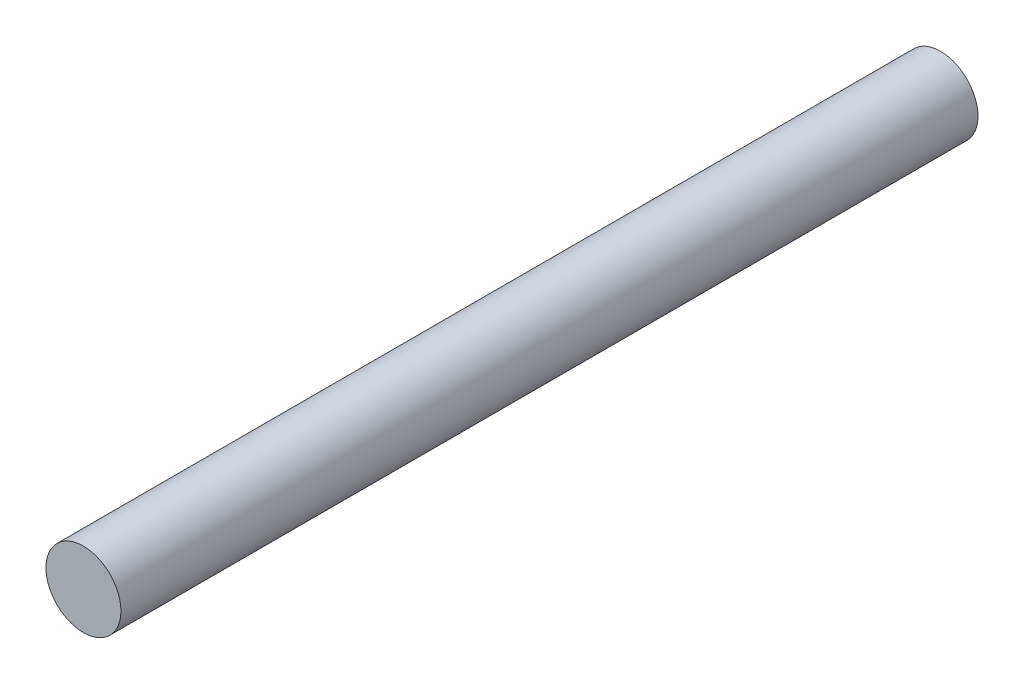
ISO-10303-21;
HEADER;
FILE_DESCRIPTION(('STEP AP214'),'2;1');
FILE_NAME('part.step','',(''),(''),'','','');
FILE_SCHEMA(('AUTOMOTIVE_DESIGN { 1 0 10303 214 1 1 1 1 }'));
ENDSEC;
DATA;
#1=APPLICATION_CONTEXT('core data for automotive mechanical design processes');
#2=APPLICATION_PROTOCOL_DEFINITION('international standard','automotive_design',2000,#1);
#3=PRODUCT_CONTEXT('',#1,'mechanical');
#4=PRODUCT('Part','Part','',(#3));
#5=PRODUCT_RELATED_PRODUCT_CATEGORY('part','',(#4));
#6=PRODUCT_DEFINITION_FORMATION('','',#4);
#7=PRODUCT_DEFINITION_CONTEXT('part definition',#1,'design');
#8=PRODUCT_DEFINITION('design','',#6,#7);
#9=PRODUCT_DEFINITION_SHAPE('','',#8);
#10=(LENGTH_UNIT() NAMED_UNIT(*) SI_UNIT(.MILLI.,.METRE.));
#11=(NAMED_UNIT(*) PLANE_ANGLE_UNIT() SI_UNIT($,.RADIAN.));
#12=(NAMED_UNIT(*) SI_UNIT($,.STERADIAN.) SOLID_ANGLE_UNIT());
#13=UNCERTAINTY_MEASURE_WITH_UNIT(LENGTH_MEASURE(1.E-05),#10,'distance_accuracy_value','');
#14=(GEOMETRIC_REPRESENTATION_CONTEXT(3) GLOBAL_UNCERTAINTY_ASSIGNED_CONTEXT((#13)) GLOBAL_UNIT_ASSIGNED_CONTEXT((#10,
#11,#12)) REPRESENTATION_CONTEXT('',''));
#15=CARTESIAN_POINT('',(0.,0.,0.));
#16=DIRECTION('',(0.,0.,1.));
#17=DIRECTION('',(1.,0.,0.));
#18=AXIS2_PLACEMENT_3D('',#15,#16,#17);
#19=CARTESIAN_POINT('',(0.,0.,12.));
#20=DIRECTION('',(0.,0.,-1.));
#21=DIRECTION('',(-1.,0.,0.));
#22=AXIS2_PLACEMENT_3D('',#19,#20,#21);
#23=CYLINDRICAL_SURFACE('',#22,0.525);
#24=CARTESIAN_POINT('',(0.,0.,12.));
#25=DIRECTION('',(0.,0.,1.));
#26=DIRECTION('',(1.,0.,0.));
#27=AXIS2_PLACEMENT_3D('',#24,#25,#26);
#28=CIRCLE('',#27,0.525);
#29=CARTESIAN_POINT('',(0.525,0.,12.));
#30=VERTEX_POINT('',#29);
#31=EDGE_CURVE('E10',#30,#30,#28,.T.);
#32=ORIENTED_EDGE('',*,*,#31,.F.);
#33=EDGE_LOOP('',(#32));
#34=FACE_BOUND('',#33,.T.);
#35=CARTESIAN_POINT('',(0.,0.,0.));
#36=DIRECTION('',(0.,0.,1.));
#37=DIRECTION('',(1.,0.,0.));
#38=AXIS2_PLACEMENT_3D('',#35,#36,#37);
#39=CIRCLE('',#38,0.525);
#40=CARTESIAN_POINT('',(0.525,0.,0.));
#41=VERTEX_POINT('',#40);
#42=EDGE_CURVE('E35',#41,#41,#39,.T.);
#43=ORIENTED_EDGE('',*,*,#42,.T.);
#44=EDGE_LOOP('',(#43));
#45=FACE_BOUND('',#44,.T.);
#46=ADVANCED_FACE('F32',(#34,#45),#23,.T.);
#47=CARTESIAN_POINT('',(0.,0.,12.));
#48=DIRECTION('',(0.,0.,1.));
#49=DIRECTION('',(1.,0.,0.));
#50=AXIS2_PLACEMENT_3D('',#47,#48,#49);
#51=PLANE('',#50);
#52=ORIENTED_EDGE('',*,*,#31,.T.);
#53=EDGE_LOOP('',(#52));
#54=FACE_BOUND('',#53,.T.);
#55=ADVANCED_FACE('F47',(#54),#51,.T.);
#56=CARTESIAN_POINT('',(0.,0.,0.));
#57=DIRECTION('',(0.,0.,1.));
#58=DIRECTION('',(1.,0.,0.));
#59=AXIS2_PLACEMENT_3D('',#56,#57,#58);
#60=PLANE('',#59);
#61=ORIENTED_EDGE('',*,*,#42,.F.);
#62=EDGE_LOOP('',(#61));
#63=FACE_BOUND('',#62,.T.);
#64=ADVANCED_FACE('F45',(#63),#60,.F.);
#65=CLOSED_SHELL('',(#46,#55,#64));
#66=MANIFOLD_SOLID_BREP('B2',#65);
#67=ADVANCED_BREP_SHAPE_REPRESENTATION('',(#18,#66),#14);
#68=SHAPE_DEFINITION_REPRESENTATION(#9,#67);
ENDSEC;
END-ISO-10303-21;
